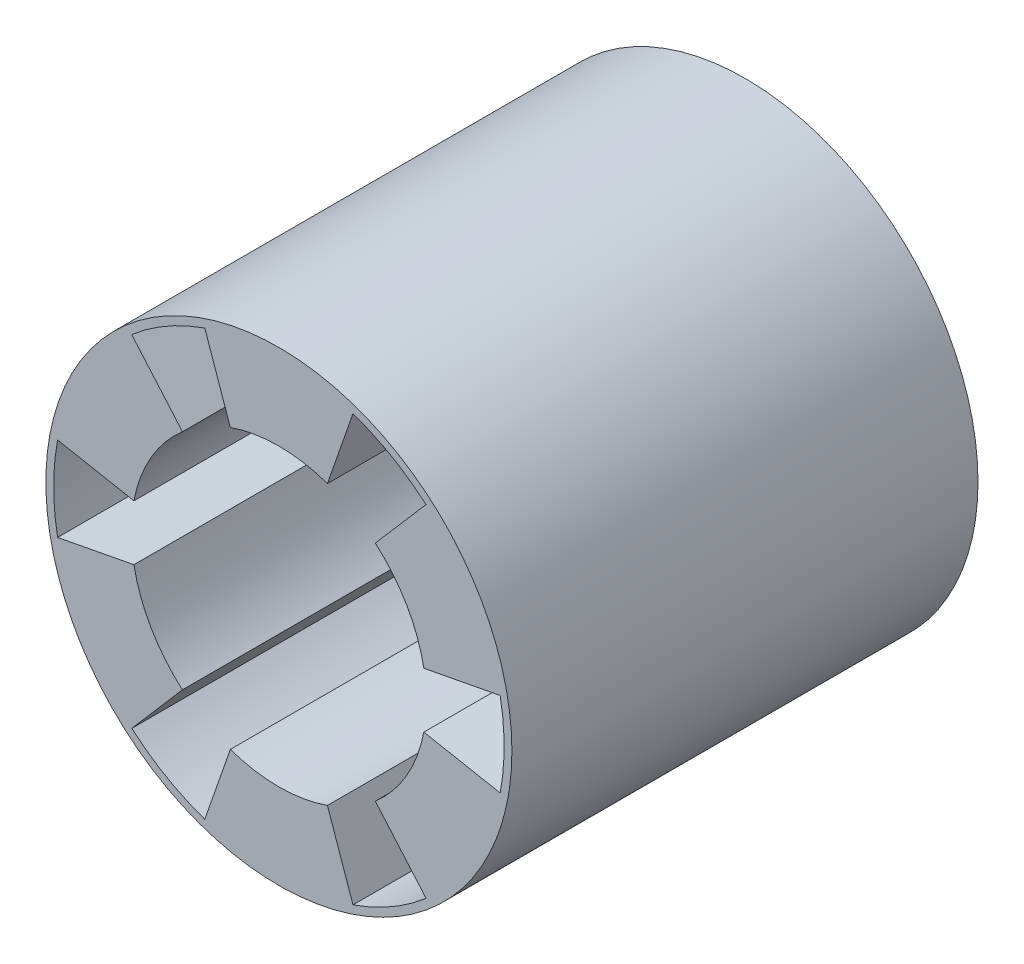
ISO-10303-21;
HEADER;
FILE_DESCRIPTION(('STEP AP214'),'2;1');
FILE_NAME('part.step','',(''),(''),'','','');
FILE_SCHEMA(('AUTOMOTIVE_DESIGN { 1 0 10303 214 1 1 1 1 }'));
ENDSEC;
DATA;
#1=APPLICATION_CONTEXT('core data for automotive mechanical design processes');
#2=APPLICATION_PROTOCOL_DEFINITION('international standard','automotive_design',2000,#1);
#3=PRODUCT_CONTEXT('',#1,'mechanical');
#4=PRODUCT('Part','Part','',(#3));
#5=PRODUCT_RELATED_PRODUCT_CATEGORY('part','',(#4));
#6=PRODUCT_DEFINITION_FORMATION('','',#4);
#7=PRODUCT_DEFINITION_CONTEXT('part definition',#1,'design');
#8=PRODUCT_DEFINITION('design','',#6,#7);
#9=PRODUCT_DEFINITION_SHAPE('','',#8);
#10=(LENGTH_UNIT() NAMED_UNIT(*) SI_UNIT(.MILLI.,.METRE.));
#11=(NAMED_UNIT(*) PLANE_ANGLE_UNIT() SI_UNIT($,.RADIAN.));
#12=(NAMED_UNIT(*) SI_UNIT($,.STERADIAN.) SOLID_ANGLE_UNIT());
#13=UNCERTAINTY_MEASURE_WITH_UNIT(LENGTH_MEASURE(1.E-05),#10,'distance_accuracy_value','');
#14=(GEOMETRIC_REPRESENTATION_CONTEXT(3) GLOBAL_UNCERTAINTY_ASSIGNED_CONTEXT((#13)) GLOBAL_UNIT_ASSIGNED_CONTEXT((#10,
#11,#12)) REPRESENTATION_CONTEXT('',''));
#15=CARTESIAN_POINT('',(0.,0.,0.));
#16=DIRECTION('',(0.,0.,1.));
#17=DIRECTION('',(1.,0.,0.));
#18=AXIS2_PLACEMENT_3D('',#15,#16,#17);
#19=CARTESIAN_POINT('',(0.,0.,60.));
#20=DIRECTION('',(0.,0.,-1.));
#21=DIRECTION('',(-1.,0.,0.));
#22=AXIS2_PLACEMENT_3D('',#19,#20,#21);
#23=CYLINDRICAL_SURFACE('',#22,30.);
#24=CARTESIAN_POINT('',(0.,0.,60.));
#25=DIRECTION('',(0.,0.,1.));
#26=DIRECTION('',(1.,0.,0.));
#27=AXIS2_PLACEMENT_3D('',#24,#25,#26);
#28=CIRCLE('',#27,30.);
#29=CARTESIAN_POINT('',(30.,0.,60.));
#30=VERTEX_POINT('',#29);
#31=EDGE_CURVE('E11',#30,#30,#28,.T.);
#32=ORIENTED_EDGE('',*,*,#31,.F.);
#33=EDGE_LOOP('',(#32));
#34=FACE_BOUND('',#33,.T.);
#35=CARTESIAN_POINT('',(0.,0.,0.));
#36=DIRECTION('',(0.,0.,1.));
#37=DIRECTION('',(1.,0.,0.));
#38=AXIS2_PLACEMENT_3D('',#35,#36,#37);
#39=CIRCLE('',#38,30.);
#40=CARTESIAN_POINT('',(30.,0.,0.));
#41=VERTEX_POINT('',#40);
#42=EDGE_CURVE('E39',#41,#41,#39,.T.);
#43=ORIENTED_EDGE('',*,*,#42,.T.);
#44=EDGE_LOOP('',(#43));
#45=FACE_BOUND('',#44,.T.);
#46=ADVANCED_FACE('F36',(#34,#45),#23,.T.);
#47=CARTESIAN_POINT('',(0.,0.,60.));
#48=DIRECTION('',(0.,0.,1.));
#49=DIRECTION('',(1.,0.,0.));
#50=AXIS2_PLACEMENT_3D('',#47,#48,#49);
#51=PLANE('',#50);
#52=CARTESIAN_POINT('',(0.,0.,60.));
#53=DIRECTION('',(0.,0.,-1.));
#54=DIRECTION('',(-1.,0.,0.));
#55=AXIS2_PLACEMENT_3D('',#52,#53,#54);
#56=CIRCLE('',#55,18.9999999999999);
#57=CARTESIAN_POINT('',(12.414353140391,14.38345702902,60.));
#58=VERTEX_POINT('',#57);
#59=CARTESIAN_POINT('',(18.6636157515684,3.55941667662016,60.));
#60=VERTEX_POINT('',#59);
#61=EDGE_CURVE('E199',#58,#60,#56,.T.);
#62=ORIENTED_EDGE('',*,*,#61,.T.);
#63=DIRECTION('',(0.982295565872031,0.187337719822106,0.));
#64=VECTOR('',#63,1.);
#65=CARTESIAN_POINT('',(18.6636157515684,3.55941667662016,60.));
#66=LINE('',#65,#64);
#67=CARTESIAN_POINT('',(28.4865714102887,5.43279387484105,60.));
#68=VERTEX_POINT('',#67);
#69=EDGE_CURVE('E208',#60,#68,#66,.T.);
#70=ORIENTED_EDGE('',*,*,#69,.T.);
#71=CARTESIAN_POINT('',(0.,0.,60.));
#72=DIRECTION('',(0.,0.,-1.));
#73=DIRECTION('',(-1.,0.,0.));
#74=AXIS2_PLACEMENT_3D('',#71,#72,#73);
#75=CIRCLE('',#74,28.9999999999998);
#76=CARTESIAN_POINT('',(28.4865714102888,-5.43279387484058,60.));
#77=VERTEX_POINT('',#76);
#78=EDGE_CURVE('E50',#68,#77,#75,.T.);
#79=ORIENTED_EDGE('',*,*,#78,.T.);
#80=DIRECTION('',(0.98229556587203,-0.187337719822109,0.));
#81=VECTOR('',#80,1.);
#82=CARTESIAN_POINT('',(18.6636157515684,-3.55941667661949,60.));
#83=LINE('',#82,#81);
#84=CARTESIAN_POINT('',(18.6636157515684,-3.55941667661949,60.));
#85=VERTEX_POINT('',#84);
#86=EDGE_CURVE('E222',#85,#77,#83,.T.);
#87=ORIENTED_EDGE('',*,*,#86,.F.);
#88=CARTESIAN_POINT('',(0.,0.,60.));
#89=DIRECTION('',(0.,0.,-1.));
#90=DIRECTION('',(-1.,0.,0.));
#91=AXIS2_PLACEMENT_3D('',#88,#89,#90);
#92=CIRCLE('',#91,18.9999999999996);
#93=CARTESIAN_POINT('',(12.4143531403911,-14.3834570290194,60.));
#94=VERTEX_POINT('',#93);
#95=EDGE_CURVE('E224',#85,#94,#92,.T.);
#96=ORIENTED_EDGE('',*,*,#95,.T.);
#97=DIRECTION('',(0.653387007389012,-0.757024054158936,0.));
#98=VECTOR('',#97,1.);
#99=CARTESIAN_POINT('',(12.414353140391,-14.3834570290193,60.));
#100=LINE('',#99,#98);
#101=CARTESIAN_POINT('',(18.9482232142811,-21.9536975706087,60.));
#102=VERTEX_POINT('',#101);
#103=EDGE_CURVE('E227',#94,#102,#100,.T.);
#104=ORIENTED_EDGE('',*,*,#103,.T.);
#105=CARTESIAN_POINT('',(0.,0.,60.));
#106=DIRECTION('',(0.,0.,-1.));
#107=DIRECTION('',(-1.,0.,0.));
#108=AXIS2_PLACEMENT_3D('',#105,#106,#107);
#109=CIRCLE('',#108,28.9999999999995);
#110=CARTESIAN_POINT('',(9.53834819600773,-27.3864914454497,60.));
#111=VERTEX_POINT('',#110);
#112=EDGE_CURVE('E230',#102,#111,#109,.T.);
#113=ORIENTED_EDGE('',*,*,#112,.T.);
#114=DIRECTION('',(0.328908558483017,-0.944361773981044,0.));
#115=VECTOR('',#114,1.);
#116=CARTESIAN_POINT('',(6.24926261117755,-17.9428737056392,60.));
#117=LINE('',#116,#115);
#118=CARTESIAN_POINT('',(6.24926261117755,-17.9428737056392,60.));
#119=VERTEX_POINT('',#118);
#120=EDGE_CURVE('E233',#119,#111,#117,.T.);
#121=ORIENTED_EDGE('',*,*,#120,.F.);
#122=CARTESIAN_POINT('',(0.,0.,60.));
#123=DIRECTION('',(0.,0.,-1.));
#124=DIRECTION('',(-1.,0.,0.));
#125=AXIS2_PLACEMENT_3D('',#122,#123,#124);
#126=CIRCLE('',#125,18.9999999999995);
#127=CARTESIAN_POINT('',(-6.24926261117732,-17.9428737056393,60.));
#128=VERTEX_POINT('',#127);
#129=EDGE_CURVE('E235',#119,#128,#126,.T.);
#130=ORIENTED_EDGE('',*,*,#129,.T.);
#131=DIRECTION('',(-0.328908558483019,-0.944361773981043,0.));
#132=VECTOR('',#131,1.);
#133=CARTESIAN_POINT('',(-6.24926261117731,-17.9428737056392,60.));
#134=LINE('',#133,#132);
#135=CARTESIAN_POINT('',(-9.5383481960075,-27.3864914454496,60.));
#136=VERTEX_POINT('',#135);
#137=EDGE_CURVE('E238',#128,#136,#134,.T.);
#138=ORIENTED_EDGE('',*,*,#137,.T.);
#139=CARTESIAN_POINT('',(0.,0.,60.));
#140=DIRECTION('',(0.,0.,-1.));
#141=DIRECTION('',(-1.,0.,0.));
#142=AXIS2_PLACEMENT_3D('',#139,#140,#141);
#143=CIRCLE('',#142,28.9999999999994);
#144=CARTESIAN_POINT('',(-18.9482232142809,-21.9536975706088,60.));
#145=VERTEX_POINT('',#144);
#146=EDGE_CURVE('E241',#136,#145,#143,.T.);
#147=ORIENTED_EDGE('',*,*,#146,.T.);
#148=DIRECTION('',(-0.653387007389014,-0.757024054158934,0.));
#149=VECTOR('',#148,1.);
#150=CARTESIAN_POINT('',(-12.4143531403908,-14.3834570290194,60.));
#151=LINE('',#150,#149);
#152=CARTESIAN_POINT('',(-12.4143531403908,-14.3834570290194,60.));
#153=VERTEX_POINT('',#152);
#154=EDGE_CURVE('E244',#153,#145,#151,.T.);
#155=ORIENTED_EDGE('',*,*,#154,.F.);
#156=CARTESIAN_POINT('',(0.,0.,60.));
#157=DIRECTION('',(0.,0.,-1.));
#158=DIRECTION('',(-1.,0.,0.));
#159=AXIS2_PLACEMENT_3D('',#156,#157,#158);
#160=CIRCLE('',#159,18.9999999999995);
#161=CARTESIAN_POINT('',(-18.6636157515682,-3.55941667661959,60.));
#162=VERTEX_POINT('',#161);
#163=EDGE_CURVE('E246',#153,#162,#160,.T.);
#164=ORIENTED_EDGE('',*,*,#163,.T.);
#165=DIRECTION('',(-0.982295565872031,-0.187337719822107,0.));
#166=VECTOR('',#165,1.);
#167=CARTESIAN_POINT('',(-18.6636157515683,-3.55941667661959,60.));
#168=LINE('',#167,#166);
#169=CARTESIAN_POINT('',(-28.4865714102886,-5.43279387484066,60.));
#170=VERTEX_POINT('',#169);
#171=EDGE_CURVE('E249',#162,#170,#168,.T.);
#172=ORIENTED_EDGE('',*,*,#171,.T.);
#173=CARTESIAN_POINT('',(0.,0.,60.));
#174=DIRECTION('',(0.,0.,-1.));
#175=DIRECTION('',(-1.,0.,0.));
#176=AXIS2_PLACEMENT_3D('',#173,#174,#175);
#177=CIRCLE('',#176,28.9999999999997);
#178=CARTESIAN_POINT('',(-28.4865714102886,5.43279387484114,60.));
#179=VERTEX_POINT('',#178);
#180=EDGE_CURVE('E252',#170,#179,#177,.T.);
#181=ORIENTED_EDGE('',*,*,#180,.T.);
#182=DIRECTION('',(-0.982295565872031,0.187337719822109,0.));
#183=VECTOR('',#182,1.);
#184=CARTESIAN_POINT('',(-18.6636157515683,3.55941667662006,60.));
#185=LINE('',#184,#183);
#186=CARTESIAN_POINT('',(-18.6636157515683,3.55941667662006,60.));
#187=VERTEX_POINT('',#186);
#188=EDGE_CURVE('E255',#187,#179,#185,.T.);
#189=ORIENTED_EDGE('',*,*,#188,.F.);
#190=CARTESIAN_POINT('',(0.,0.,60.));
#191=DIRECTION('',(0.,0.,-1.));
#192=DIRECTION('',(-1.,0.,0.));
#193=AXIS2_PLACEMENT_3D('',#190,#191,#192);
#194=CIRCLE('',#193,18.9999999999998);
#195=CARTESIAN_POINT('',(-12.4143531403909,14.3834570290199,60.));
#196=VERTEX_POINT('',#195);
#197=EDGE_CURVE('E257',#187,#196,#194,.T.);
#198=ORIENTED_EDGE('',*,*,#197,.T.);
#199=DIRECTION('',(-0.653387007389012,0.757024054158936,0.));
#200=VECTOR('',#199,1.);
#201=CARTESIAN_POINT('',(-12.4143531403909,14.3834570290199,60.));
#202=LINE('',#201,#200);
#203=CARTESIAN_POINT('',(-18.948223214281,21.9536975706093,60.));
#204=VERTEX_POINT('',#203);
#205=EDGE_CURVE('E260',#196,#204,#202,.T.);
#206=ORIENTED_EDGE('',*,*,#205,.T.);
#207=CARTESIAN_POINT('',(0.,0.,60.));
#208=DIRECTION('',(0.,0.,-1.));
#209=DIRECTION('',(-1.,0.,0.));
#210=AXIS2_PLACEMENT_3D('',#207,#208,#209);
#211=CIRCLE('',#210,28.9999999999999);
#212=CARTESIAN_POINT('',(-9.53834819600761,27.3864914454502,60.));
#213=VERTEX_POINT('',#212);
#214=EDGE_CURVE('E263',#204,#213,#211,.T.);
#215=ORIENTED_EDGE('',*,*,#214,.T.);
#216=DIRECTION('',(-0.328908558483022,0.944361773981042,0.));
#217=VECTOR('',#216,1.);
#218=CARTESIAN_POINT('',(-6.24926261117742,17.9428737056398,60.));
#219=LINE('',#218,#217);
#220=CARTESIAN_POINT('',(-6.24926261117742,17.9428737056398,60.));
#221=VERTEX_POINT('',#220);
#222=EDGE_CURVE('E266',#221,#213,#219,.T.);
#223=ORIENTED_EDGE('',*,*,#222,.F.);
#224=CARTESIAN_POINT('',(0.,0.,60.));
#225=DIRECTION('',(0.,0.,-1.));
#226=DIRECTION('',(-1.,0.,0.));
#227=AXIS2_PLACEMENT_3D('',#224,#225,#226);
#228=CIRCLE('',#227,19.);
#229=CARTESIAN_POINT('',(6.24926261117741,17.9428737056398,60.));
#230=VERTEX_POINT('',#229);
#231=EDGE_CURVE('E268',#221,#230,#228,.T.);
#232=ORIENTED_EDGE('',*,*,#231,.T.);
#233=DIRECTION('',(0.328908558483022,0.944361773981042,0.));
#234=VECTOR('',#233,1.);
#235=CARTESIAN_POINT('',(6.24926261117742,17.9428737056398,60.));
#236=LINE('',#235,#234);
#237=CARTESIAN_POINT('',(9.53834819600763,27.3864914454502,60.));
#238=VERTEX_POINT('',#237);
#239=EDGE_CURVE('E271',#230,#238,#236,.T.);
#240=ORIENTED_EDGE('',*,*,#239,.T.);
#241=CARTESIAN_POINT('',(0.,0.,60.));
#242=DIRECTION('',(0.,0.,-1.));
#243=DIRECTION('',(-1.,0.,0.));
#244=AXIS2_PLACEMENT_3D('',#241,#242,#243);
#245=CIRCLE('',#244,29.);
#246=CARTESIAN_POINT('',(18.9482232142811,21.9536975706094,60.));
#247=VERTEX_POINT('',#246);
#248=EDGE_CURVE('E274',#238,#247,#245,.T.);
#249=ORIENTED_EDGE('',*,*,#248,.T.);
#250=DIRECTION('',(0.653387007389014,0.757024054158934,0.));
#251=VECTOR('',#250,1.);
#252=CARTESIAN_POINT('',(12.414353140391,14.38345702902,60.));
#253=LINE('',#252,#251);
#254=EDGE_CURVE('E205',#58,#247,#253,.T.);
#255=ORIENTED_EDGE('',*,*,#254,.F.);
#256=EDGE_LOOP('',(#62,#70,#79,#87,#96,#104,#113,#121,#130,#138,#147,#155,#164,#172,#181,#189,
#198,#206,#215,#223,#232,#240,#249,#255));
#257=FACE_BOUND('',#256,.T.);
#258=ORIENTED_EDGE('',*,*,#31,.T.);
#259=EDGE_LOOP('',(#258));
#260=FACE_BOUND('',#259,.T.);
#261=ADVANCED_FACE('F212',(#257,#260),#51,.T.);
#262=CARTESIAN_POINT('',(0.,0.,0.));
#263=DIRECTION('',(0.,0.,1.));
#264=DIRECTION('',(1.,0.,0.));
#265=AXIS2_PLACEMENT_3D('',#262,#263,#264);
#266=PLANE('',#265);
#267=DIRECTION('',(0.982295565872031,0.187337719822106,0.));
#268=VECTOR('',#267,1.);
#269=CARTESIAN_POINT('',(18.6636157515684,3.55941667662016,0.));
#270=LINE('',#269,#268);
#271=CARTESIAN_POINT('',(18.6636157515684,3.55941667661998,0.));
#272=VERTEX_POINT('',#271);
#273=CARTESIAN_POINT('',(28.4865714102887,5.43279387484122,0.));
#274=VERTEX_POINT('',#273);
#275=EDGE_CURVE('E278',#272,#274,#270,.T.);
#276=ORIENTED_EDGE('',*,*,#275,.F.);
#277=CARTESIAN_POINT('',(0.,0.,0.));
#278=DIRECTION('',(0.,0.,-1.));
#279=DIRECTION('',(-1.,0.,0.));
#280=AXIS2_PLACEMENT_3D('',#277,#278,#279);
#281=CIRCLE('',#280,18.9999999999999);
#282=CARTESIAN_POINT('',(12.414353140391,14.38345702902,0.));
#283=VERTEX_POINT('',#282);
#284=EDGE_CURVE('E58',#283,#272,#281,.T.);
#285=ORIENTED_EDGE('',*,*,#284,.F.);
#286=DIRECTION('',(0.653387007389014,0.757024054158934,0.));
#287=VECTOR('',#286,1.);
#288=CARTESIAN_POINT('',(12.414353140391,14.38345702902,0.));
#289=LINE('',#288,#287);
#290=CARTESIAN_POINT('',(18.9482232142811,21.9536975706094,0.));
#291=VERTEX_POINT('',#290);
#292=EDGE_CURVE('E215',#283,#291,#289,.T.);
#293=ORIENTED_EDGE('',*,*,#292,.T.);
#294=CARTESIAN_POINT('',(0.,0.,0.));
#295=DIRECTION('',(0.,0.,-1.));
#296=DIRECTION('',(-1.,0.,0.));
#297=AXIS2_PLACEMENT_3D('',#294,#295,#296);
#298=CIRCLE('',#297,29.);
#299=CARTESIAN_POINT('',(9.53834819600763,27.3864914454502,0.));
#300=VERTEX_POINT('',#299);
#301=EDGE_CURVE('E218',#300,#291,#298,.T.);
#302=ORIENTED_EDGE('',*,*,#301,.F.);
#303=DIRECTION('',(0.328908558483022,0.944361773981042,0.));
#304=VECTOR('',#303,1.);
#305=CARTESIAN_POINT('',(6.24926261117742,17.9428737056398,0.));
#306=LINE('',#305,#304);
#307=CARTESIAN_POINT('',(6.24926261117741,17.9428737056398,0.));
#308=VERTEX_POINT('',#307);
#309=EDGE_CURVE('E337',#308,#300,#306,.T.);
#310=ORIENTED_EDGE('',*,*,#309,.F.);
#311=CARTESIAN_POINT('',(0.,0.,0.));
#312=DIRECTION('',(0.,0.,-1.));
#313=DIRECTION('',(-1.,0.,0.));
#314=AXIS2_PLACEMENT_3D('',#311,#312,#313);
#315=CIRCLE('',#314,19.);
#316=CARTESIAN_POINT('',(-6.24926261117742,17.9428737056398,0.));
#317=VERTEX_POINT('',#316);
#318=EDGE_CURVE('E334',#317,#308,#315,.T.);
#319=ORIENTED_EDGE('',*,*,#318,.F.);
#320=DIRECTION('',(-0.328908558483022,0.944361773981042,0.));
#321=VECTOR('',#320,1.);
#322=CARTESIAN_POINT('',(-6.24926261117742,17.9428737056398,0.));
#323=LINE('',#322,#321);
#324=CARTESIAN_POINT('',(-9.53834819600761,27.3864914454502,0.));
#325=VERTEX_POINT('',#324);
#326=EDGE_CURVE('E331',#317,#325,#323,.T.);
#327=ORIENTED_EDGE('',*,*,#326,.T.);
#328=CARTESIAN_POINT('',(0.,0.,0.));
#329=DIRECTION('',(0.,0.,-1.));
#330=DIRECTION('',(-1.,0.,0.));
#331=AXIS2_PLACEMENT_3D('',#328,#329,#330);
#332=CIRCLE('',#331,28.9999999999999);
#333=CARTESIAN_POINT('',(-18.948223214281,21.9536975706093,0.));
#334=VERTEX_POINT('',#333);
#335=EDGE_CURVE('E328',#334,#325,#332,.T.);
#336=ORIENTED_EDGE('',*,*,#335,.F.);
#337=DIRECTION('',(-0.653387007389012,0.757024054158936,0.));
#338=VECTOR('',#337,1.);
#339=CARTESIAN_POINT('',(-12.4143531403909,14.3834570290199,0.));
#340=LINE('',#339,#338);
#341=CARTESIAN_POINT('',(-12.4143531403909,14.3834570290199,0.));
#342=VERTEX_POINT('',#341);
#343=EDGE_CURVE('E325',#342,#334,#340,.T.);
#344=ORIENTED_EDGE('',*,*,#343,.F.);
#345=CARTESIAN_POINT('',(0.,0.,0.));
#346=DIRECTION('',(0.,0.,-1.));
#347=DIRECTION('',(-1.,0.,0.));
#348=AXIS2_PLACEMENT_3D('',#345,#346,#347);
#349=CIRCLE('',#348,18.9999999999998);
#350=CARTESIAN_POINT('',(-18.6636157515683,3.55941667662006,0.));
#351=VERTEX_POINT('',#350);
#352=EDGE_CURVE('E322',#351,#342,#349,.T.);
#353=ORIENTED_EDGE('',*,*,#352,.F.);
#354=DIRECTION('',(-0.982295565872031,0.187337719822109,0.));
#355=VECTOR('',#354,1.);
#356=CARTESIAN_POINT('',(-18.6636157515683,3.55941667662006,0.));
#357=LINE('',#356,#355);
#358=CARTESIAN_POINT('',(-28.4865714102886,5.43279387484114,0.));
#359=VERTEX_POINT('',#358);
#360=EDGE_CURVE('E319',#351,#359,#357,.T.);
#361=ORIENTED_EDGE('',*,*,#360,.T.);
#362=CARTESIAN_POINT('',(0.,0.,0.));
#363=DIRECTION('',(0.,0.,-1.));
#364=DIRECTION('',(-1.,0.,0.));
#365=AXIS2_PLACEMENT_3D('',#362,#363,#364);
#366=CIRCLE('',#365,28.9999999999997);
#367=CARTESIAN_POINT('',(-28.4865714102886,-5.43279387484066,0.));
#368=VERTEX_POINT('',#367);
#369=EDGE_CURVE('E316',#368,#359,#366,.T.);
#370=ORIENTED_EDGE('',*,*,#369,.F.);
#371=DIRECTION('',(-0.982295565872031,-0.187337719822107,0.));
#372=VECTOR('',#371,1.);
#373=CARTESIAN_POINT('',(-18.6636157515683,-3.55941667661959,0.));
#374=LINE('',#373,#372);
#375=CARTESIAN_POINT('',(-18.6636157515682,-3.55941667661959,0.));
#376=VERTEX_POINT('',#375);
#377=EDGE_CURVE('E313',#376,#368,#374,.T.);
#378=ORIENTED_EDGE('',*,*,#377,.F.);
#379=CARTESIAN_POINT('',(0.,0.,0.));
#380=DIRECTION('',(0.,0.,-1.));
#381=DIRECTION('',(-1.,0.,0.));
#382=AXIS2_PLACEMENT_3D('',#379,#380,#381);
#383=CIRCLE('',#382,18.9999999999995);
#384=CARTESIAN_POINT('',(-12.4143531403908,-14.3834570290194,0.));
#385=VERTEX_POINT('',#384);
#386=EDGE_CURVE('E310',#385,#376,#383,.T.);
#387=ORIENTED_EDGE('',*,*,#386,.F.);
#388=DIRECTION('',(-0.653387007389014,-0.757024054158934,0.));
#389=VECTOR('',#388,1.);
#390=CARTESIAN_POINT('',(-12.4143531403908,-14.3834570290194,0.));
#391=LINE('',#390,#389);
#392=CARTESIAN_POINT('',(-18.9482232142809,-21.9536975706088,0.));
#393=VERTEX_POINT('',#392);
#394=EDGE_CURVE('E307',#385,#393,#391,.T.);
#395=ORIENTED_EDGE('',*,*,#394,.T.);
#396=CARTESIAN_POINT('',(0.,0.,0.));
#397=DIRECTION('',(0.,0.,-1.));
#398=DIRECTION('',(-1.,0.,0.));
#399=AXIS2_PLACEMENT_3D('',#396,#397,#398);
#400=CIRCLE('',#399,28.9999999999994);
#401=CARTESIAN_POINT('',(-9.5383481960075,-27.3864914454496,0.));
#402=VERTEX_POINT('',#401);
#403=EDGE_CURVE('E304',#402,#393,#400,.T.);
#404=ORIENTED_EDGE('',*,*,#403,.F.);
#405=DIRECTION('',(-0.328908558483019,-0.944361773981043,0.));
#406=VECTOR('',#405,1.);
#407=CARTESIAN_POINT('',(-6.24926261117731,-17.9428737056392,0.));
#408=LINE('',#407,#406);
#409=CARTESIAN_POINT('',(-6.24926261117732,-17.9428737056393,0.));
#410=VERTEX_POINT('',#409);
#411=EDGE_CURVE('E301',#410,#402,#408,.T.);
#412=ORIENTED_EDGE('',*,*,#411,.F.);
#413=CARTESIAN_POINT('',(0.,0.,0.));
#414=DIRECTION('',(0.,0.,-1.));
#415=DIRECTION('',(-1.,0.,0.));
#416=AXIS2_PLACEMENT_3D('',#413,#414,#415);
#417=CIRCLE('',#416,18.9999999999995);
#418=CARTESIAN_POINT('',(6.24926261117755,-17.9428737056392,0.));
#419=VERTEX_POINT('',#418);
#420=EDGE_CURVE('E298',#419,#410,#417,.T.);
#421=ORIENTED_EDGE('',*,*,#420,.F.);
#422=DIRECTION('',(0.328908558483017,-0.944361773981044,0.));
#423=VECTOR('',#422,1.);
#424=CARTESIAN_POINT('',(6.24926261117755,-17.9428737056392,0.));
#425=LINE('',#424,#423);
#426=CARTESIAN_POINT('',(9.53834819600773,-27.3864914454497,0.));
#427=VERTEX_POINT('',#426);
#428=EDGE_CURVE('E295',#419,#427,#425,.T.);
#429=ORIENTED_EDGE('',*,*,#428,.T.);
#430=CARTESIAN_POINT('',(0.,0.,0.));
#431=DIRECTION('',(0.,0.,-1.));
#432=DIRECTION('',(-1.,0.,0.));
#433=AXIS2_PLACEMENT_3D('',#430,#431,#432);
#434=CIRCLE('',#433,28.9999999999995);
#435=CARTESIAN_POINT('',(18.9482232142811,-21.9536975706087,0.));
#436=VERTEX_POINT('',#435);
#437=EDGE_CURVE('E292',#436,#427,#434,.T.);
#438=ORIENTED_EDGE('',*,*,#437,.F.);
#439=DIRECTION('',(0.653387007389012,-0.757024054158936,0.));
#440=VECTOR('',#439,1.);
#441=CARTESIAN_POINT('',(12.414353140391,-14.3834570290193,0.));
#442=LINE('',#441,#440);
#443=CARTESIAN_POINT('',(12.4143531403911,-14.3834570290194,0.));
#444=VERTEX_POINT('',#443);
#445=EDGE_CURVE('E289',#444,#436,#442,.T.);
#446=ORIENTED_EDGE('',*,*,#445,.F.);
#447=CARTESIAN_POINT('',(0.,0.,0.));
#448=DIRECTION('',(0.,0.,-1.));
#449=DIRECTION('',(-1.,0.,0.));
#450=AXIS2_PLACEMENT_3D('',#447,#448,#449);
#451=CIRCLE('',#450,18.9999999999996);
#452=CARTESIAN_POINT('',(18.6636157515684,-3.55941667661949,0.));
#453=VERTEX_POINT('',#452);
#454=EDGE_CURVE('E286',#453,#444,#451,.T.);
#455=ORIENTED_EDGE('',*,*,#454,.F.);
#456=DIRECTION('',(0.98229556587203,-0.187337719822109,0.));
#457=VECTOR('',#456,1.);
#458=CARTESIAN_POINT('',(18.6636157515684,-3.55941667661949,0.));
#459=LINE('',#458,#457);
#460=CARTESIAN_POINT('',(28.4865714102888,-5.43279387484058,0.));
#461=VERTEX_POINT('',#460);
#462=EDGE_CURVE('E283',#453,#461,#459,.T.);
#463=ORIENTED_EDGE('',*,*,#462,.T.);
#464=CARTESIAN_POINT('',(0.,0.,0.));
#465=DIRECTION('',(0.,0.,-1.));
#466=DIRECTION('',(-1.,0.,0.));
#467=AXIS2_PLACEMENT_3D('',#464,#465,#466);
#468=CIRCLE('',#467,28.9999999999998);
#469=EDGE_CURVE('E280',#274,#461,#468,.T.);
#470=ORIENTED_EDGE('',*,*,#469,.F.);
#471=EDGE_LOOP('',(#276,#285,#293,#302,#310,#319,#327,#336,#344,#353,#361,#370,#378,#387,#395,
#404,#412,#421,#429,#438,#446,#455,#463,#470));
#472=FACE_BOUND('',#471,.T.);
#473=ORIENTED_EDGE('',*,*,#42,.F.);
#474=EDGE_LOOP('',(#473));
#475=FACE_BOUND('',#474,.T.);
#476=ADVANCED_FACE('F389',(#472,#475),#266,.F.);
#477=CARTESIAN_POINT('',(0.,0.,60.));
#478=DIRECTION('',(0.,0.,-1.));
#479=DIRECTION('',(-1.,0.,0.));
#480=AXIS2_PLACEMENT_3D('',#477,#478,#479);
#481=CYLINDRICAL_SURFACE('',#480,18.9999999999999);
#482=ORIENTED_EDGE('',*,*,#284,.T.);
#483=DIRECTION('',(0.,0.,-1.));
#484=VECTOR('',#483,1.);
#485=CARTESIAN_POINT('',(18.6636157515684,3.55941667662016,60.));
#486=LINE('',#485,#484);
#487=EDGE_CURVE('E195',#60,#272,#486,.T.);
#488=ORIENTED_EDGE('',*,*,#487,.F.);
#489=ORIENTED_EDGE('',*,*,#61,.F.);
#490=DIRECTION('',(0.,0.,-1.));
#491=VECTOR('',#490,1.);
#492=CARTESIAN_POINT('',(12.414353140391,14.38345702902,60.));
#493=LINE('',#492,#491);
#494=EDGE_CURVE('E342',#58,#283,#493,.T.);
#495=ORIENTED_EDGE('',*,*,#494,.T.);
#496=EDGE_LOOP('',(#482,#488,#489,#495));
#497=FACE_BOUND('',#496,.T.);
#498=ADVANCED_FACE('F197',(#497),#481,.F.);
#499=CARTESIAN_POINT('',(12.414353140391,14.38345702902,60.));
#500=DIRECTION('',(-0.757024054158934,0.653387007389014,0.));
#501=DIRECTION('',(-0.653387007389014,-0.757024054158934,0.));
#502=AXIS2_PLACEMENT_3D('',#499,#500,#501);
#503=PLANE('',#502);
#504=ORIENTED_EDGE('',*,*,#292,.F.);
#505=ORIENTED_EDGE('',*,*,#494,.F.);
#506=ORIENTED_EDGE('',*,*,#254,.T.);
#507=DIRECTION('',(0.,0.,-1.));
#508=VECTOR('',#507,1.);
#509=CARTESIAN_POINT('',(18.9482232142811,21.9536975706094,60.));
#510=LINE('',#509,#508);
#511=EDGE_CURVE('E344',#247,#291,#510,.T.);
#512=ORIENTED_EDGE('',*,*,#511,.T.);
#513=EDGE_LOOP('',(#504,#505,#506,#512));
#514=FACE_BOUND('',#513,.T.);
#515=ADVANCED_FACE('F478',(#514),#503,.T.);
#516=CARTESIAN_POINT('',(0.,0.,60.));
#517=DIRECTION('',(0.,0.,-1.));
#518=DIRECTION('',(-1.,0.,0.));
#519=AXIS2_PLACEMENT_3D('',#516,#517,#518);
#520=CYLINDRICAL_SURFACE('',#519,29.);
#521=ORIENTED_EDGE('',*,*,#301,.T.);
#522=ORIENTED_EDGE('',*,*,#511,.F.);
#523=ORIENTED_EDGE('',*,*,#248,.F.);
#524=DIRECTION('',(0.,0.,-1.));
#525=VECTOR('',#524,1.);
#526=CARTESIAN_POINT('',(9.53834819600763,27.3864914454502,60.));
#527=LINE('',#526,#525);
#528=EDGE_CURVE('E346',#238,#300,#527,.T.);
#529=ORIENTED_EDGE('',*,*,#528,.T.);
#530=EDGE_LOOP('',(#521,#522,#523,#529));
#531=FACE_BOUND('',#530,.T.);
#532=ADVANCED_FACE('F474',(#531),#520,.F.);
#533=CARTESIAN_POINT('',(6.24926261117742,17.9428737056398,60.));
#534=DIRECTION('',(-0.944361773981042,0.328908558483022,0.));
#535=DIRECTION('',(-0.328908558483022,-0.944361773981042,0.));
#536=AXIS2_PLACEMENT_3D('',#533,#534,#535);
#537=PLANE('',#536);
#538=ORIENTED_EDGE('',*,*,#309,.T.);
#539=ORIENTED_EDGE('',*,*,#528,.F.);
#540=ORIENTED_EDGE('',*,*,#239,.F.);
#541=DIRECTION('',(0.,0.,-1.));
#542=VECTOR('',#541,1.);
#543=CARTESIAN_POINT('',(6.24926261117741,17.9428737056398,60.));
#544=LINE('',#543,#542);
#545=EDGE_CURVE('E348',#230,#308,#544,.T.);
#546=ORIENTED_EDGE('',*,*,#545,.T.);
#547=EDGE_LOOP('',(#538,#539,#540,#546));
#548=FACE_BOUND('',#547,.T.);
#549=ADVANCED_FACE('F470',(#548),#537,.F.);
#550=CARTESIAN_POINT('',(0.,0.,60.));
#551=DIRECTION('',(0.,0.,-1.));
#552=DIRECTION('',(-1.,0.,0.));
#553=AXIS2_PLACEMENT_3D('',#550,#551,#552);
#554=CYLINDRICAL_SURFACE('',#553,19.);
#555=ORIENTED_EDGE('',*,*,#318,.T.);
#556=ORIENTED_EDGE('',*,*,#545,.F.);
#557=ORIENTED_EDGE('',*,*,#231,.F.);
#558=DIRECTION('',(0.,0.,-1.));
#559=VECTOR('',#558,1.);
#560=CARTESIAN_POINT('',(-6.24926261117742,17.9428737056398,60.));
#561=LINE('',#560,#559);
#562=EDGE_CURVE('E350',#221,#317,#561,.T.);
#563=ORIENTED_EDGE('',*,*,#562,.T.);
#564=EDGE_LOOP('',(#555,#556,#557,#563));
#565=FACE_BOUND('',#564,.T.);
#566=ADVANCED_FACE('F466',(#565),#554,.F.);
#567=CARTESIAN_POINT('',(-6.24926261117742,17.9428737056398,60.));
#568=DIRECTION('',(-0.944361773981042,-0.328908558483022,0.));
#569=DIRECTION('',(0.328908558483022,-0.944361773981042,0.));
#570=AXIS2_PLACEMENT_3D('',#567,#568,#569);
#571=PLANE('',#570);
#572=ORIENTED_EDGE('',*,*,#326,.F.);
#573=ORIENTED_EDGE('',*,*,#562,.F.);
#574=ORIENTED_EDGE('',*,*,#222,.T.);
#575=DIRECTION('',(0.,0.,-1.));
#576=VECTOR('',#575,1.);
#577=CARTESIAN_POINT('',(-9.53834819600761,27.3864914454502,60.));
#578=LINE('',#577,#576);
#579=EDGE_CURVE('E352',#213,#325,#578,.T.);
#580=ORIENTED_EDGE('',*,*,#579,.T.);
#581=EDGE_LOOP('',(#572,#573,#574,#580));
#582=FACE_BOUND('',#581,.T.);
#583=ADVANCED_FACE('F463',(#582),#571,.T.);
#584=CARTESIAN_POINT('',(0.,0.,60.));
#585=DIRECTION('',(0.,0.,-1.));
#586=DIRECTION('',(-1.,0.,0.));
#587=AXIS2_PLACEMENT_3D('',#584,#585,#586);
#588=CYLINDRICAL_SURFACE('',#587,28.9999999999999);
#589=ORIENTED_EDGE('',*,*,#335,.T.);
#590=ORIENTED_EDGE('',*,*,#579,.F.);
#591=ORIENTED_EDGE('',*,*,#214,.F.);
#592=DIRECTION('',(0.,0.,-1.));
#593=VECTOR('',#592,1.);
#594=CARTESIAN_POINT('',(-18.948223214281,21.9536975706093,60.));
#595=LINE('',#594,#593);
#596=EDGE_CURVE('E354',#204,#334,#595,.T.);
#597=ORIENTED_EDGE('',*,*,#596,.T.);
#598=EDGE_LOOP('',(#589,#590,#591,#597));
#599=FACE_BOUND('',#598,.T.);
#600=ADVANCED_FACE('F458',(#599),#588,.F.);
#601=CARTESIAN_POINT('',(-12.4143531403909,14.3834570290199,60.));
#602=DIRECTION('',(-0.757024054158936,-0.653387007389012,0.));
#603=DIRECTION('',(0.653387007389012,-0.757024054158936,0.));
#604=AXIS2_PLACEMENT_3D('',#601,#602,#603);
#605=PLANE('',#604);
#606=ORIENTED_EDGE('',*,*,#343,.T.);
#607=ORIENTED_EDGE('',*,*,#596,.F.);
#608=ORIENTED_EDGE('',*,*,#205,.F.);
#609=DIRECTION('',(0.,0.,-1.));
#610=VECTOR('',#609,1.);
#611=CARTESIAN_POINT('',(-12.4143531403909,14.3834570290199,60.));
#612=LINE('',#611,#610);
#613=EDGE_CURVE('E356',#196,#342,#612,.T.);
#614=ORIENTED_EDGE('',*,*,#613,.T.);
#615=EDGE_LOOP('',(#606,#607,#608,#614));
#616=FACE_BOUND('',#615,.T.);
#617=ADVANCED_FACE('F453',(#616),#605,.F.);
#618=CARTESIAN_POINT('',(0.,0.,60.));
#619=DIRECTION('',(0.,0.,-1.));
#620=DIRECTION('',(-1.,0.,0.));
#621=AXIS2_PLACEMENT_3D('',#618,#619,#620);
#622=CYLINDRICAL_SURFACE('',#621,18.9999999999998);
#623=ORIENTED_EDGE('',*,*,#352,.T.);
#624=ORIENTED_EDGE('',*,*,#613,.F.);
#625=ORIENTED_EDGE('',*,*,#197,.F.);
#626=DIRECTION('',(0.,0.,-1.));
#627=VECTOR('',#626,1.);
#628=CARTESIAN_POINT('',(-18.6636157515683,3.55941667662006,60.));
#629=LINE('',#628,#627);
#630=EDGE_CURVE('E358',#187,#351,#629,.T.);
#631=ORIENTED_EDGE('',*,*,#630,.T.);
#632=EDGE_LOOP('',(#623,#624,#625,#631));
#633=FACE_BOUND('',#632,.T.);
#634=ADVANCED_FACE('F450',(#633),#622,.F.);
#635=CARTESIAN_POINT('',(-18.6636157515683,3.55941667662006,60.));
#636=DIRECTION('',(-0.187337719822109,-0.982295565872031,0.));
#637=DIRECTION('',(0.982295565872031,-0.187337719822109,0.));
#638=AXIS2_PLACEMENT_3D('',#635,#636,#637);
#639=PLANE('',#638);
#640=ORIENTED_EDGE('',*,*,#360,.F.);
#641=ORIENTED_EDGE('',*,*,#630,.F.);
#642=ORIENTED_EDGE('',*,*,#188,.T.);
#643=DIRECTION('',(0.,0.,-1.));
#644=VECTOR('',#643,1.);
#645=CARTESIAN_POINT('',(-28.4865714102886,5.43279387484114,60.));
#646=LINE('',#645,#644);
#647=EDGE_CURVE('E360',#179,#359,#646,.T.);
#648=ORIENTED_EDGE('',*,*,#647,.T.);
#649=EDGE_LOOP('',(#640,#641,#642,#648));
#650=FACE_BOUND('',#649,.T.);
#651=ADVANCED_FACE('F445',(#650),#639,.T.);
#652=CARTESIAN_POINT('',(0.,0.,60.));
#653=DIRECTION('',(0.,0.,-1.));
#654=DIRECTION('',(-1.,0.,0.));
#655=AXIS2_PLACEMENT_3D('',#652,#653,#654);
#656=CYLINDRICAL_SURFACE('',#655,28.9999999999997);
#657=ORIENTED_EDGE('',*,*,#369,.T.);
#658=ORIENTED_EDGE('',*,*,#647,.F.);
#659=ORIENTED_EDGE('',*,*,#180,.F.);
#660=DIRECTION('',(0.,0.,-1.));
#661=VECTOR('',#660,1.);
#662=CARTESIAN_POINT('',(-28.4865714102886,-5.43279387484066,60.));
#663=LINE('',#662,#661);
#664=EDGE_CURVE('E362',#170,#368,#663,.T.);
#665=ORIENTED_EDGE('',*,*,#664,.T.);
#666=EDGE_LOOP('',(#657,#658,#659,#665));
#667=FACE_BOUND('',#666,.T.);
#668=ADVANCED_FACE('F442',(#667),#656,.F.);
#669=CARTESIAN_POINT('',(-18.6636157515683,-3.55941667661959,60.));
#670=DIRECTION('',(0.187337719822107,-0.982295565872031,0.));
#671=DIRECTION('',(0.982295565872031,0.187337719822107,0.));
#672=AXIS2_PLACEMENT_3D('',#669,#670,#671);
#673=PLANE('',#672);
#674=ORIENTED_EDGE('',*,*,#377,.T.);
#675=ORIENTED_EDGE('',*,*,#664,.F.);
#676=ORIENTED_EDGE('',*,*,#171,.F.);
#677=DIRECTION('',(0.,0.,-1.));
#678=VECTOR('',#677,1.);
#679=CARTESIAN_POINT('',(-18.6636157515682,-3.55941667661959,60.));
#680=LINE('',#679,#678);
#681=EDGE_CURVE('E364',#162,#376,#680,.T.);
#682=ORIENTED_EDGE('',*,*,#681,.T.);
#683=EDGE_LOOP('',(#674,#675,#676,#682));
#684=FACE_BOUND('',#683,.T.);
#685=ADVANCED_FACE('F437',(#684),#673,.F.);
#686=CARTESIAN_POINT('',(0.,0.,60.));
#687=DIRECTION('',(0.,0.,-1.));
#688=DIRECTION('',(-1.,0.,0.));
#689=AXIS2_PLACEMENT_3D('',#686,#687,#688);
#690=CYLINDRICAL_SURFACE('',#689,18.9999999999995);
#691=ORIENTED_EDGE('',*,*,#386,.T.);
#692=ORIENTED_EDGE('',*,*,#681,.F.);
#693=ORIENTED_EDGE('',*,*,#163,.F.);
#694=DIRECTION('',(0.,0.,-1.));
#695=VECTOR('',#694,1.);
#696=CARTESIAN_POINT('',(-12.4143531403908,-14.3834570290194,60.));
#697=LINE('',#696,#695);
#698=EDGE_CURVE('E366',#153,#385,#697,.T.);
#699=ORIENTED_EDGE('',*,*,#698,.T.);
#700=EDGE_LOOP('',(#691,#692,#693,#699));
#701=FACE_BOUND('',#700,.T.);
#702=ADVANCED_FACE('F432',(#701),#690,.F.);
#703=CARTESIAN_POINT('',(-12.4143531403908,-14.3834570290194,60.));
#704=DIRECTION('',(0.757024054158934,-0.653387007389014,0.));
#705=DIRECTION('',(0.653387007389014,0.757024054158934,0.));
#706=AXIS2_PLACEMENT_3D('',#703,#704,#705);
#707=PLANE('',#706);
#708=ORIENTED_EDGE('',*,*,#394,.F.);
#709=ORIENTED_EDGE('',*,*,#698,.F.);
#710=ORIENTED_EDGE('',*,*,#154,.T.);
#711=DIRECTION('',(0.,0.,-1.));
#712=VECTOR('',#711,1.);
#713=CARTESIAN_POINT('',(-18.9482232142809,-21.9536975706088,60.));
#714=LINE('',#713,#712);
#715=EDGE_CURVE('E368',#145,#393,#714,.T.);
#716=ORIENTED_EDGE('',*,*,#715,.T.);
#717=EDGE_LOOP('',(#708,#709,#710,#716));
#718=FACE_BOUND('',#717,.T.);
#719=ADVANCED_FACE('F428',(#718),#707,.T.);
#720=CARTESIAN_POINT('',(0.,0.,60.));
#721=DIRECTION('',(0.,0.,-1.));
#722=DIRECTION('',(-1.,0.,0.));
#723=AXIS2_PLACEMENT_3D('',#720,#721,#722);
#724=CYLINDRICAL_SURFACE('',#723,28.9999999999994);
#725=ORIENTED_EDGE('',*,*,#403,.T.);
#726=ORIENTED_EDGE('',*,*,#715,.F.);
#727=ORIENTED_EDGE('',*,*,#146,.F.);
#728=DIRECTION('',(0.,0.,-1.));
#729=VECTOR('',#728,1.);
#730=CARTESIAN_POINT('',(-9.5383481960075,-27.3864914454496,60.));
#731=LINE('',#730,#729);
#732=EDGE_CURVE('E370',#136,#402,#731,.T.);
#733=ORIENTED_EDGE('',*,*,#732,.T.);
#734=EDGE_LOOP('',(#725,#726,#727,#733));
#735=FACE_BOUND('',#734,.T.);
#736=ADVANCED_FACE('F424',(#735),#724,.F.);
#737=CARTESIAN_POINT('',(-6.24926261117731,-17.9428737056392,60.));
#738=DIRECTION('',(0.944361773981043,-0.328908558483019,0.));
#739=DIRECTION('',(0.328908558483019,0.944361773981043,0.));
#740=AXIS2_PLACEMENT_3D('',#737,#738,#739);
#741=PLANE('',#740);
#742=ORIENTED_EDGE('',*,*,#411,.T.);
#743=ORIENTED_EDGE('',*,*,#732,.F.);
#744=ORIENTED_EDGE('',*,*,#137,.F.);
#745=DIRECTION('',(0.,0.,-1.));
#746=VECTOR('',#745,1.);
#747=CARTESIAN_POINT('',(-6.24926261117732,-17.9428737056393,60.));
#748=LINE('',#747,#746);
#749=EDGE_CURVE('E372',#128,#410,#748,.T.);
#750=ORIENTED_EDGE('',*,*,#749,.T.);
#751=EDGE_LOOP('',(#742,#743,#744,#750));
#752=FACE_BOUND('',#751,.T.);
#753=ADVANCED_FACE('F419',(#752),#741,.F.);
#754=CARTESIAN_POINT('',(0.,0.,60.));
#755=DIRECTION('',(0.,0.,-1.));
#756=DIRECTION('',(-1.,0.,0.));
#757=AXIS2_PLACEMENT_3D('',#754,#755,#756);
#758=CYLINDRICAL_SURFACE('',#757,18.9999999999995);
#759=ORIENTED_EDGE('',*,*,#420,.T.);
#760=ORIENTED_EDGE('',*,*,#749,.F.);
#761=ORIENTED_EDGE('',*,*,#129,.F.);
#762=DIRECTION('',(0.,0.,-1.));
#763=VECTOR('',#762,1.);
#764=CARTESIAN_POINT('',(6.24926261117755,-17.9428737056392,60.));
#765=LINE('',#764,#763);
#766=EDGE_CURVE('E374',#119,#419,#765,.T.);
#767=ORIENTED_EDGE('',*,*,#766,.T.);
#768=EDGE_LOOP('',(#759,#760,#761,#767));
#769=FACE_BOUND('',#768,.T.);
#770=ADVANCED_FACE('F415',(#769),#758,.F.);
#771=CARTESIAN_POINT('',(6.24926261117755,-17.9428737056392,60.));
#772=DIRECTION('',(0.944361773981044,0.328908558483017,0.));
#773=DIRECTION('',(-0.328908558483017,0.944361773981044,0.));
#774=AXIS2_PLACEMENT_3D('',#771,#772,#773);
#775=PLANE('',#774);
#776=ORIENTED_EDGE('',*,*,#428,.F.);
#777=ORIENTED_EDGE('',*,*,#766,.F.);
#778=ORIENTED_EDGE('',*,*,#120,.T.);
#779=DIRECTION('',(0.,0.,-1.));
#780=VECTOR('',#779,1.);
#781=CARTESIAN_POINT('',(9.53834819600773,-27.3864914454497,60.));
#782=LINE('',#781,#780);
#783=EDGE_CURVE('E376',#111,#427,#782,.T.);
#784=ORIENTED_EDGE('',*,*,#783,.T.);
#785=EDGE_LOOP('',(#776,#777,#778,#784));
#786=FACE_BOUND('',#785,.T.);
#787=ADVANCED_FACE('F412',(#786),#775,.T.);
#788=CARTESIAN_POINT('',(0.,0.,60.));
#789=DIRECTION('',(0.,0.,-1.));
#790=DIRECTION('',(-1.,0.,0.));
#791=AXIS2_PLACEMENT_3D('',#788,#789,#790);
#792=CYLINDRICAL_SURFACE('',#791,28.9999999999995);
#793=ORIENTED_EDGE('',*,*,#437,.T.);
#794=ORIENTED_EDGE('',*,*,#783,.F.);
#795=ORIENTED_EDGE('',*,*,#112,.F.);
#796=DIRECTION('',(0.,0.,-1.));
#797=VECTOR('',#796,1.);
#798=CARTESIAN_POINT('',(18.9482232142811,-21.9536975706087,60.));
#799=LINE('',#798,#797);
#800=EDGE_CURVE('E378',#102,#436,#799,.T.);
#801=ORIENTED_EDGE('',*,*,#800,.T.);
#802=EDGE_LOOP('',(#793,#794,#795,#801));
#803=FACE_BOUND('',#802,.T.);
#804=ADVANCED_FACE('F407',(#803),#792,.F.);
#805=CARTESIAN_POINT('',(12.414353140391,-14.3834570290193,60.));
#806=DIRECTION('',(0.757024054158936,0.653387007389012,0.));
#807=DIRECTION('',(-0.653387007389012,0.757024054158936,0.));
#808=AXIS2_PLACEMENT_3D('',#805,#806,#807);
#809=PLANE('',#808);
#810=ORIENTED_EDGE('',*,*,#445,.T.);
#811=ORIENTED_EDGE('',*,*,#800,.F.);
#812=ORIENTED_EDGE('',*,*,#103,.F.);
#813=DIRECTION('',(0.,0.,-1.));
#814=VECTOR('',#813,1.);
#815=CARTESIAN_POINT('',(12.4143531403911,-14.3834570290194,60.));
#816=LINE('',#815,#814);
#817=EDGE_CURVE('E380',#94,#444,#816,.T.);
#818=ORIENTED_EDGE('',*,*,#817,.T.);
#819=EDGE_LOOP('',(#810,#811,#812,#818));
#820=FACE_BOUND('',#819,.T.);
#821=ADVANCED_FACE('F402',(#820),#809,.F.);
#822=CARTESIAN_POINT('',(0.,0.,60.));
#823=DIRECTION('',(0.,0.,-1.));
#824=DIRECTION('',(-1.,0.,0.));
#825=AXIS2_PLACEMENT_3D('',#822,#823,#824);
#826=CYLINDRICAL_SURFACE('',#825,18.9999999999996);
#827=ORIENTED_EDGE('',*,*,#454,.T.);
#828=ORIENTED_EDGE('',*,*,#817,.F.);
#829=ORIENTED_EDGE('',*,*,#95,.F.);
#830=DIRECTION('',(0.,0.,-1.));
#831=VECTOR('',#830,1.);
#832=CARTESIAN_POINT('',(18.6636157515684,-3.55941667661949,60.));
#833=LINE('',#832,#831);
#834=EDGE_CURVE('E382',#85,#453,#833,.T.);
#835=ORIENTED_EDGE('',*,*,#834,.T.);
#836=EDGE_LOOP('',(#827,#828,#829,#835));
#837=FACE_BOUND('',#836,.T.);
#838=ADVANCED_FACE('F400',(#837),#826,.F.);
#839=CARTESIAN_POINT('',(18.6636157515684,-3.55941667661949,60.));
#840=DIRECTION('',(0.187337719822109,0.98229556587203,0.));
#841=DIRECTION('',(-0.982295565872031,0.187337719822109,0.));
#842=AXIS2_PLACEMENT_3D('',#839,#840,#841);
#843=PLANE('',#842);
#844=ORIENTED_EDGE('',*,*,#462,.F.);
#845=ORIENTED_EDGE('',*,*,#834,.F.);
#846=ORIENTED_EDGE('',*,*,#86,.T.);
#847=DIRECTION('',(0.,0.,-1.));
#848=VECTOR('',#847,1.);
#849=CARTESIAN_POINT('',(28.4865714102888,-5.43279387484058,60.));
#850=LINE('',#849,#848);
#851=EDGE_CURVE('E384',#77,#461,#850,.T.);
#852=ORIENTED_EDGE('',*,*,#851,.T.);
#853=EDGE_LOOP('',(#844,#845,#846,#852));
#854=FACE_BOUND('',#853,.T.);
#855=ADVANCED_FACE('F395',(#854),#843,.T.);
#856=CARTESIAN_POINT('',(0.,0.,60.));
#857=DIRECTION('',(0.,0.,-1.));
#858=DIRECTION('',(-1.,0.,0.));
#859=AXIS2_PLACEMENT_3D('',#856,#857,#858);
#860=CYLINDRICAL_SURFACE('',#859,28.9999999999998);
#861=ORIENTED_EDGE('',*,*,#469,.T.);
#862=ORIENTED_EDGE('',*,*,#851,.F.);
#863=ORIENTED_EDGE('',*,*,#78,.F.);
#864=DIRECTION('',(0.,0.,-1.));
#865=VECTOR('',#864,1.);
#866=CARTESIAN_POINT('',(28.4865714102887,5.43279387484122,60.));
#867=LINE('',#866,#865);
#868=EDGE_CURVE('E204',#68,#274,#867,.T.);
#869=ORIENTED_EDGE('',*,*,#868,.T.);
#870=EDGE_LOOP('',(#861,#862,#863,#869));
#871=FACE_BOUND('',#870,.T.);
#872=ADVANCED_FACE('F386',(#871),#860,.F.);
#873=CARTESIAN_POINT('',(18.6636157515684,3.55941667662016,60.));
#874=DIRECTION('',(-0.187337719822106,0.982295565872031,0.));
#875=DIRECTION('',(-0.982295565872031,-0.187337719822106,0.));
#876=AXIS2_PLACEMENT_3D('',#873,#874,#875);
#877=PLANE('',#876);
#878=ORIENTED_EDGE('',*,*,#275,.T.);
#879=ORIENTED_EDGE('',*,*,#868,.F.);
#880=ORIENTED_EDGE('',*,*,#69,.F.);
#881=ORIENTED_EDGE('',*,*,#487,.T.);
#882=EDGE_LOOP('',(#878,#879,#880,#881));
#883=FACE_BOUND('',#882,.T.);
#884=ADVANCED_FACE('F209',(#883),#877,.F.);
#885=CLOSED_SHELL('',(#46,#261,#476,#498,#515,#532,#549,#566,#583,#600,#617,#634,#651,#668,#685,
#702,#719,#736,#753,#770,#787,#804,#821,#838,#855,#872,#884));
#886=MANIFOLD_SOLID_BREP('B2',#885);
#887=ADVANCED_BREP_SHAPE_REPRESENTATION('',(#18,#886),#14);
#888=SHAPE_DEFINITION_REPRESENTATION(#9,#887);
ENDSEC;
END-ISO-10303-21;
